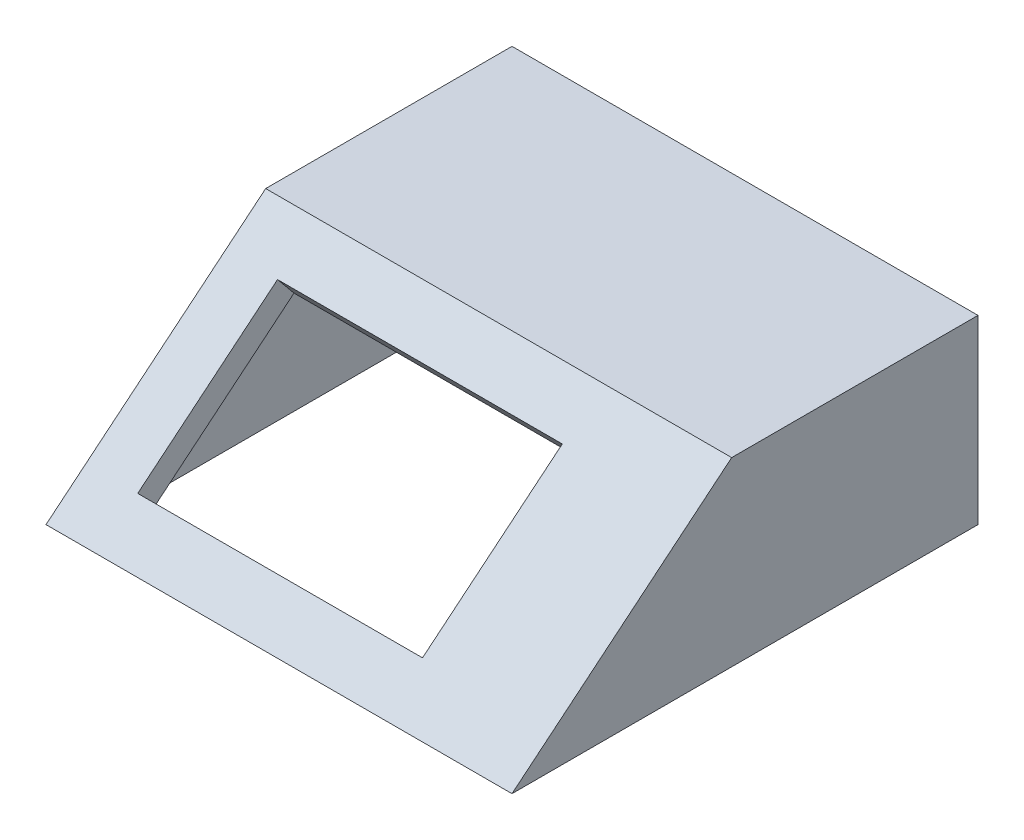
ISO-10303-21;
HEADER;
FILE_DESCRIPTION(('STEP AP214'),'2;1');
FILE_NAME('part.step','',(''),(''),'','','');
FILE_SCHEMA(('AUTOMOTIVE_DESIGN { 1 0 10303 214 1 1 1 1 }'));
ENDSEC;
DATA;
#1=APPLICATION_CONTEXT('core data for automotive mechanical design processes');
#2=APPLICATION_PROTOCOL_DEFINITION('international standard','automotive_design',2000,#1);
#3=PRODUCT_CONTEXT('',#1,'mechanical');
#4=PRODUCT('Part','Part','',(#3));
#5=PRODUCT_RELATED_PRODUCT_CATEGORY('part','',(#4));
#6=PRODUCT_DEFINITION_FORMATION('','',#4);
#7=PRODUCT_DEFINITION_CONTEXT('part definition',#1,'design');
#8=PRODUCT_DEFINITION('design','',#6,#7);
#9=PRODUCT_DEFINITION_SHAPE('','',#8);
#10=(LENGTH_UNIT() NAMED_UNIT(*) SI_UNIT(.MILLI.,.METRE.));
#11=(NAMED_UNIT(*) PLANE_ANGLE_UNIT() SI_UNIT($,.RADIAN.));
#12=(NAMED_UNIT(*) SI_UNIT($,.STERADIAN.) SOLID_ANGLE_UNIT());
#13=UNCERTAINTY_MEASURE_WITH_UNIT(LENGTH_MEASURE(1.E-05),#10,'distance_accuracy_value','');
#14=(GEOMETRIC_REPRESENTATION_CONTEXT(3) GLOBAL_UNCERTAINTY_ASSIGNED_CONTEXT((#13)) GLOBAL_UNIT_ASSIGNED_CONTEXT((#10,
#11,#12)) REPRESENTATION_CONTEXT('',''));
#15=CARTESIAN_POINT('',(0.,0.,0.));
#16=DIRECTION('',(0.,0.,1.));
#17=DIRECTION('',(1.,0.,0.));
#18=AXIS2_PLACEMENT_3D('',#15,#16,#17);
#19=CARTESIAN_POINT('',(-90.,-17.5,0.));
#20=DIRECTION('',(0.,-1.,0.));
#21=DIRECTION('',(0.,0.,-1.));
#22=AXIS2_PLACEMENT_3D('',#19,#20,#21);
#23=PLANE('',#22);
#24=DIRECTION('',(0.,0.,1.));
#25=VECTOR('',#24,1.);
#26=CARTESIAN_POINT('',(-5.,-17.5,58.3560605784536));
#27=LINE('',#26,#25);
#28=CARTESIAN_POINT('',(-5.,-17.5,-18.7867965644036));
#29=VERTEX_POINT('',#28);
#30=CARTESIAN_POINT('',(-5.,-17.5,58.3560605784536));
#31=VERTEX_POINT('',#30);
#32=EDGE_CURVE('E196',#29,#31,#27,.T.);
#33=ORIENTED_EDGE('',*,*,#32,.F.);
#34=DIRECTION('',(-1.,0.,0.));
#35=VECTOR('',#34,1.);
#36=CARTESIAN_POINT('',(82.7708910678342,-17.5,-18.7867965644036));
#37=LINE('',#36,#35);
#38=CARTESIAN_POINT('',(-85.,-17.5,-18.7867965644036));
#39=VERTEX_POINT('',#38);
#40=EDGE_CURVE('E201',#29,#39,#37,.T.);
#41=ORIENTED_EDGE('',*,*,#40,.T.);
#42=DIRECTION('',(0.,0.,-1.));
#43=VECTOR('',#42,1.);
#44=CARTESIAN_POINT('',(-85.,-17.5,58.3560605784536));
#45=LINE('',#44,#43);
#46=CARTESIAN_POINT('',(-85.,-17.5,58.3560605784536));
#47=VERTEX_POINT('',#46);
#48=EDGE_CURVE('E184',#47,#39,#45,.T.);
#49=ORIENTED_EDGE('',*,*,#48,.F.);
#50=DIRECTION('',(-1.,0.,0.));
#51=VECTOR('',#50,1.);
#52=CARTESIAN_POINT('',(82.7708910678342,-17.5,58.3560605784536));
#53=LINE('',#52,#51);
#54=EDGE_CURVE('E200',#31,#47,#53,.T.);
#55=ORIENTED_EDGE('',*,*,#54,.F.);
#56=EDGE_LOOP('',(#33,#41,#49,#55));
#57=FACE_BOUND('',#56,.T.);
#58=DIRECTION('',(0.,0.,-1.));
#59=VECTOR('',#58,1.);
#60=CARTESIAN_POINT('',(0.,-17.5,0.));
#61=LINE('',#60,#59);
#62=CARTESIAN_POINT('',(0.,-17.5,66.2132034355964));
#63=VERTEX_POINT('',#62);
#64=CARTESIAN_POINT('',(0.,-17.5,-23.7867965644036));
#65=VERTEX_POINT('',#64);
#66=EDGE_CURVE('E221',#63,#65,#61,.T.);
#67=ORIENTED_EDGE('',*,*,#66,.F.);
#68=DIRECTION('',(1.,0.,0.));
#69=VECTOR('',#68,1.);
#70=CARTESIAN_POINT('',(-90.,-17.5,66.2132034355964));
#71=LINE('',#70,#69);
#72=CARTESIAN_POINT('',(-90.,-17.5,66.2132034355964));
#73=VERTEX_POINT('',#72);
#74=EDGE_CURVE('E12',#73,#63,#71,.T.);
#75=ORIENTED_EDGE('',*,*,#74,.F.);
#76=DIRECTION('',(0.,0.,-1.));
#77=VECTOR('',#76,1.);
#78=CARTESIAN_POINT('',(-90.,-17.5,0.));
#79=LINE('',#78,#77);
#80=CARTESIAN_POINT('',(-90.,-17.5,-23.7867965644036));
#81=VERTEX_POINT('',#80);
#82=EDGE_CURVE('E222',#73,#81,#79,.T.);
#83=ORIENTED_EDGE('',*,*,#82,.T.);
#84=DIRECTION('',(1.,0.,0.));
#85=VECTOR('',#84,1.);
#86=CARTESIAN_POINT('',(-90.,-17.5,-23.7867965644036));
#87=LINE('',#86,#85);
#88=EDGE_CURVE('E50',#81,#65,#87,.T.);
#89=ORIENTED_EDGE('',*,*,#88,.T.);
#90=EDGE_LOOP('',(#67,#75,#83,#89));
#91=FACE_BOUND('',#90,.T.);
#92=ADVANCED_FACE('F47',(#57,#91),#23,.T.);
#93=CARTESIAN_POINT('',(-90.,22.0897820899599,18.2231404958678));
#94=DIRECTION('',(0.,0.77138921583987,0.636363636363636));
#95=DIRECTION('',(0.,-0.636363636363636,0.77138921583987));
#96=AXIS2_PLACEMENT_3D('',#93,#94,#95);
#97=PLANE('',#96);
#98=DIRECTION('',(0.,0.636363636363636,-0.77138921583987));
#99=VECTOR('',#98,1.);
#100=CARTESIAN_POINT('',(-25.,-11.1363636363636,58.4993112771977));
#101=LINE('',#100,#99);
#102=CARTESIAN_POINT('',(-25.,-11.1363636363636,58.4993112771977));
#103=VERTEX_POINT('',#102);
#104=CARTESIAN_POINT('',(-25.,11.1363636363636,31.5006887228023));
#105=VERTEX_POINT('',#104);
#106=EDGE_CURVE('E64',#103,#105,#101,.T.);
#107=ORIENTED_EDGE('',*,*,#106,.F.);
#108=DIRECTION('',(1.,0.,0.));
#109=VECTOR('',#108,1.);
#110=CARTESIAN_POINT('',(-80.,-11.1363636363636,58.4993112771977));
#111=LINE('',#110,#109);
#112=CARTESIAN_POINT('',(-80.,-11.1363636363636,58.4993112771977));
#113=VERTEX_POINT('',#112);
#114=EDGE_CURVE('E158',#113,#103,#111,.T.);
#115=ORIENTED_EDGE('',*,*,#114,.F.);
#116=DIRECTION('',(0.,-0.636363636363636,0.77138921583987));
#117=VECTOR('',#116,1.);
#118=CARTESIAN_POINT('',(-80.,-11.1363636363636,58.4993112771977));
#119=LINE('',#118,#117);
#120=CARTESIAN_POINT('',(-80.,11.1363636363636,31.5006887228023));
#121=VERTEX_POINT('',#120);
#122=EDGE_CURVE('E140',#121,#113,#119,.T.);
#123=ORIENTED_EDGE('',*,*,#122,.F.);
#124=DIRECTION('',(-1.,0.,0.));
#125=VECTOR('',#124,1.);
#126=CARTESIAN_POINT('',(-80.,11.1363636363636,31.5006887228023));
#127=LINE('',#126,#125);
#128=EDGE_CURVE('E150',#105,#121,#127,.T.);
#129=ORIENTED_EDGE('',*,*,#128,.F.);
#130=EDGE_LOOP('',(#107,#115,#123,#129));
#131=FACE_BOUND('',#130,.T.);
#132=DIRECTION('',(0.,-0.636363636363636,0.77138921583987));
#133=VECTOR('',#132,1.);
#134=CARTESIAN_POINT('',(0.,22.0897820899599,18.2231404958678));
#135=LINE('',#134,#133);
#136=CARTESIAN_POINT('',(0.,17.5,23.7867965644036));
#137=VERTEX_POINT('',#136);
#138=EDGE_CURVE('E227',#137,#63,#135,.T.);
#139=ORIENTED_EDGE('',*,*,#138,.F.);
#140=DIRECTION('',(1.,0.,0.));
#141=VECTOR('',#140,1.);
#142=CARTESIAN_POINT('',(-90.,17.5,23.7867965644036));
#143=LINE('',#142,#141);
#144=CARTESIAN_POINT('',(-90.,17.5,23.7867965644036));
#145=VERTEX_POINT('',#144);
#146=EDGE_CURVE('E56',#145,#137,#143,.T.);
#147=ORIENTED_EDGE('',*,*,#146,.F.);
#148=DIRECTION('',(0.,-0.636363636363636,0.77138921583987));
#149=VECTOR('',#148,1.);
#150=CARTESIAN_POINT('',(-90.,22.0897820899599,18.2231404958678));
#151=LINE('',#150,#149);
#152=EDGE_CURVE('E234',#145,#73,#151,.T.);
#153=ORIENTED_EDGE('',*,*,#152,.T.);
#154=ORIENTED_EDGE('',*,*,#74,.T.);
#155=EDGE_LOOP('',(#139,#147,#153,#154));
#156=FACE_BOUND('',#155,.T.);
#157=ADVANCED_FACE('F155',(#131,#156),#97,.T.);
#158=CARTESIAN_POINT('',(-90.,17.5,0.));
#159=DIRECTION('',(0.,-1.,0.));
#160=DIRECTION('',(0.,0.,-1.));
#161=AXIS2_PLACEMENT_3D('',#158,#159,#160);
#162=PLANE('',#161);
#163=DIRECTION('',(0.,0.,-1.));
#164=VECTOR('',#163,1.);
#165=CARTESIAN_POINT('',(0.,17.5,0.));
#166=LINE('',#165,#164);
#167=CARTESIAN_POINT('',(0.,17.5,-23.7867965644036));
#168=VERTEX_POINT('',#167);
#169=EDGE_CURVE('E245',#137,#168,#166,.T.);
#170=ORIENTED_EDGE('',*,*,#169,.T.);
#171=DIRECTION('',(1.,0.,0.));
#172=VECTOR('',#171,1.);
#173=CARTESIAN_POINT('',(-90.,17.5,-23.7867965644036));
#174=LINE('',#173,#172);
#175=CARTESIAN_POINT('',(-90.,17.5,-23.7867965644036));
#176=VERTEX_POINT('',#175);
#177=EDGE_CURVE('E253',#176,#168,#174,.T.);
#178=ORIENTED_EDGE('',*,*,#177,.F.);
#179=DIRECTION('',(0.,0.,-1.));
#180=VECTOR('',#179,1.);
#181=CARTESIAN_POINT('',(-90.,17.5,0.));
#182=LINE('',#181,#180);
#183=EDGE_CURVE('E231',#145,#176,#182,.T.);
#184=ORIENTED_EDGE('',*,*,#183,.F.);
#185=ORIENTED_EDGE('',*,*,#146,.T.);
#186=EDGE_LOOP('',(#170,#178,#184,#185));
#187=FACE_BOUND('',#186,.T.);
#188=ADVANCED_FACE('F273',(#187),#162,.F.);
#189=CARTESIAN_POINT('',(-90.,0.,-23.7867965644036));
#190=DIRECTION('',(0.,0.,-1.));
#191=DIRECTION('',(0.,1.,0.));
#192=AXIS2_PLACEMENT_3D('',#189,#190,#191);
#193=PLANE('',#192);
#194=DIRECTION('',(0.,1.,0.));
#195=VECTOR('',#194,1.);
#196=CARTESIAN_POINT('',(0.,0.,-23.7867965644036));
#197=LINE('',#196,#195);
#198=EDGE_CURVE('E241',#65,#168,#197,.T.);
#199=ORIENTED_EDGE('',*,*,#198,.F.);
#200=ORIENTED_EDGE('',*,*,#88,.F.);
#201=DIRECTION('',(0.,1.,0.));
#202=VECTOR('',#201,1.);
#203=CARTESIAN_POINT('',(-90.,0.,-23.7867965644036));
#204=LINE('',#203,#202);
#205=EDGE_CURVE('E226',#81,#176,#204,.T.);
#206=ORIENTED_EDGE('',*,*,#205,.T.);
#207=ORIENTED_EDGE('',*,*,#177,.T.);
#208=EDGE_LOOP('',(#199,#200,#206,#207));
#209=FACE_BOUND('',#208,.T.);
#210=ADVANCED_FACE('F263',(#209),#193,.T.);
#211=CARTESIAN_POINT('',(-90.,0.,0.));
#212=DIRECTION('',(1.,0.,0.));
#213=DIRECTION('',(0.,0.,-1.));
#214=AXIS2_PLACEMENT_3D('',#211,#212,#213);
#215=PLANE('',#214);
#216=ORIENTED_EDGE('',*,*,#82,.F.);
#217=ORIENTED_EDGE('',*,*,#152,.F.);
#218=ORIENTED_EDGE('',*,*,#183,.T.);
#219=ORIENTED_EDGE('',*,*,#205,.F.);
#220=EDGE_LOOP('',(#216,#217,#218,#219));
#221=FACE_BOUND('',#220,.T.);
#222=ADVANCED_FACE('F271',(#221),#215,.F.);
#223=CARTESIAN_POINT('',(0.,0.,0.));
#224=DIRECTION('',(1.,0.,0.));
#225=DIRECTION('',(0.,0.,-1.));
#226=AXIS2_PLACEMENT_3D('',#223,#224,#225);
#227=PLANE('',#226);
#228=ORIENTED_EDGE('',*,*,#66,.T.);
#229=ORIENTED_EDGE('',*,*,#198,.T.);
#230=ORIENTED_EDGE('',*,*,#169,.F.);
#231=ORIENTED_EDGE('',*,*,#138,.T.);
#232=EDGE_LOOP('',(#228,#229,#230,#231));
#233=FACE_BOUND('',#232,.T.);
#234=ADVANCED_FACE('F266',(#233),#227,.T.);
#235=CARTESIAN_POINT('',(-5.,0.,0.));
#236=DIRECTION('',(1.,0.,0.));
#237=DIRECTION('',(0.,0.,-1.));
#238=AXIS2_PLACEMENT_3D('',#235,#236,#237);
#239=PLANE('',#238);
#240=ORIENTED_EDGE('',*,*,#32,.T.);
#241=DIRECTION('',(0.,0.636363636363636,-0.77138921583987));
#242=VECTOR('',#241,1.);
#243=CARTESIAN_POINT('',(-5.,12.5,21.990568974574));
#244=LINE('',#243,#242);
#245=CARTESIAN_POINT('',(-5.,12.5,21.990568974574));
#246=VERTEX_POINT('',#245);
#247=EDGE_CURVE('E188',#31,#246,#244,.T.);
#248=ORIENTED_EDGE('',*,*,#247,.T.);
#249=DIRECTION('',(0.,0.,-1.));
#250=VECTOR('',#249,1.);
#251=CARTESIAN_POINT('',(-5.,12.5,-18.7867965644036));
#252=LINE('',#251,#250);
#253=CARTESIAN_POINT('',(-5.,12.5,-18.7867965644036));
#254=VERTEX_POINT('',#253);
#255=EDGE_CURVE('E207',#246,#254,#252,.T.);
#256=ORIENTED_EDGE('',*,*,#255,.T.);
#257=DIRECTION('',(0.,-1.,0.));
#258=VECTOR('',#257,1.);
#259=CARTESIAN_POINT('',(-5.,-17.5,-18.7867965644036));
#260=LINE('',#259,#258);
#261=EDGE_CURVE('E202',#254,#29,#260,.T.);
#262=ORIENTED_EDGE('',*,*,#261,.T.);
#263=EDGE_LOOP('',(#240,#248,#256,#262));
#264=FACE_BOUND('',#263,.T.);
#265=ADVANCED_FACE('F289',(#264),#239,.F.);
#266=CARTESIAN_POINT('',(82.7708910678342,12.5,21.990568974574));
#267=DIRECTION('',(0.,0.77138921583987,0.636363636363636));
#268=DIRECTION('',(0.,-0.636363636363636,0.77138921583987));
#269=AXIS2_PLACEMENT_3D('',#266,#267,#268);
#270=PLANE('',#269);
#271=DIRECTION('',(-1.,0.,0.));
#272=VECTOR('',#271,1.);
#273=CARTESIAN_POINT('',(-80.,-14.993309715563,55.3174930953795));
#274=LINE('',#273,#272);
#275=CARTESIAN_POINT('',(-25.,-14.993309715563,55.3174930953795));
#276=VERTEX_POINT('',#275);
#277=CARTESIAN_POINT('',(-80.,-14.993309715563,55.3174930953795));
#278=VERTEX_POINT('',#277);
#279=EDGE_CURVE('E467',#276,#278,#274,.T.);
#280=ORIENTED_EDGE('',*,*,#279,.F.);
#281=DIRECTION('',(0.,-0.636363636363636,0.77138921583987));
#282=VECTOR('',#281,1.);
#283=CARTESIAN_POINT('',(-25.,-14.993309715563,55.3174930953795));
#284=LINE('',#283,#282);
#285=CARTESIAN_POINT('',(-25.,7.2794175571643,28.3188705409841));
#286=VERTEX_POINT('',#285);
#287=EDGE_CURVE('E176',#286,#276,#284,.T.);
#288=ORIENTED_EDGE('',*,*,#287,.F.);
#289=DIRECTION('',(1.,0.,0.));
#290=VECTOR('',#289,1.);
#291=CARTESIAN_POINT('',(-80.,7.2794175571643,28.3188705409841));
#292=LINE('',#291,#290);
#293=CARTESIAN_POINT('',(-80.,7.27941755716429,28.3188705409841));
#294=VERTEX_POINT('',#293);
#295=EDGE_CURVE('E172',#294,#286,#292,.T.);
#296=ORIENTED_EDGE('',*,*,#295,.F.);
#297=DIRECTION('',(0.,0.636363636363636,-0.77138921583987));
#298=VECTOR('',#297,1.);
#299=CARTESIAN_POINT('',(-80.,-14.993309715563,55.3174930953795));
#300=LINE('',#299,#298);
#301=EDGE_CURVE('E143',#278,#294,#300,.T.);
#302=ORIENTED_EDGE('',*,*,#301,.F.);
#303=EDGE_LOOP('',(#280,#288,#296,#302));
#304=FACE_BOUND('',#303,.T.);
#305=ORIENTED_EDGE('',*,*,#54,.T.);
#306=DIRECTION('',(0.,-0.636363636363636,0.77138921583987));
#307=VECTOR('',#306,1.);
#308=CARTESIAN_POINT('',(-85.,12.5,21.990568974574));
#309=LINE('',#308,#307);
#310=CARTESIAN_POINT('',(-85.,12.5,21.990568974574));
#311=VERTEX_POINT('',#310);
#312=EDGE_CURVE('E181',#311,#47,#309,.T.);
#313=ORIENTED_EDGE('',*,*,#312,.F.);
#314=DIRECTION('',(-1.,0.,0.));
#315=VECTOR('',#314,1.);
#316=CARTESIAN_POINT('',(82.7708910678342,12.5,21.990568974574));
#317=LINE('',#316,#315);
#318=EDGE_CURVE('E195',#246,#311,#317,.T.);
#319=ORIENTED_EDGE('',*,*,#318,.F.);
#320=ORIENTED_EDGE('',*,*,#247,.F.);
#321=EDGE_LOOP('',(#305,#313,#319,#320));
#322=FACE_BOUND('',#321,.T.);
#323=ADVANCED_FACE('F301',(#304,#322),#270,.F.);
#324=CARTESIAN_POINT('',(82.7708910678342,12.5,-18.7867965644036));
#325=DIRECTION('',(0.,1.,0.));
#326=DIRECTION('',(0.,0.,1.));
#327=AXIS2_PLACEMENT_3D('',#324,#325,#326);
#328=PLANE('',#327);
#329=ORIENTED_EDGE('',*,*,#318,.T.);
#330=DIRECTION('',(0.,0.,1.));
#331=VECTOR('',#330,1.);
#332=CARTESIAN_POINT('',(-85.,12.5,-18.7867965644036));
#333=LINE('',#332,#331);
#334=CARTESIAN_POINT('',(-85.,12.5,-18.7867965644036));
#335=VERTEX_POINT('',#334);
#336=EDGE_CURVE('E177',#335,#311,#333,.T.);
#337=ORIENTED_EDGE('',*,*,#336,.F.);
#338=DIRECTION('',(-1.,0.,0.));
#339=VECTOR('',#338,1.);
#340=CARTESIAN_POINT('',(82.7708910678342,12.5,-18.7867965644036));
#341=LINE('',#340,#339);
#342=EDGE_CURVE('E206',#254,#335,#341,.T.);
#343=ORIENTED_EDGE('',*,*,#342,.F.);
#344=ORIENTED_EDGE('',*,*,#255,.F.);
#345=EDGE_LOOP('',(#329,#337,#343,#344));
#346=FACE_BOUND('',#345,.T.);
#347=ADVANCED_FACE('F295',(#346),#328,.F.);
#348=CARTESIAN_POINT('',(82.7708910678342,-17.5,-18.7867965644036));
#349=DIRECTION('',(0.,0.,-1.));
#350=DIRECTION('',(0.,1.,0.));
#351=AXIS2_PLACEMENT_3D('',#348,#349,#350);
#352=PLANE('',#351);
#353=ORIENTED_EDGE('',*,*,#342,.T.);
#354=DIRECTION('',(0.,1.,0.));
#355=VECTOR('',#354,1.);
#356=CARTESIAN_POINT('',(-85.,-17.5,-18.7867965644036));
#357=LINE('',#356,#355);
#358=EDGE_CURVE('E175',#39,#335,#357,.T.);
#359=ORIENTED_EDGE('',*,*,#358,.F.);
#360=ORIENTED_EDGE('',*,*,#40,.F.);
#361=ORIENTED_EDGE('',*,*,#261,.F.);
#362=EDGE_LOOP('',(#353,#359,#360,#361));
#363=FACE_BOUND('',#362,.T.);
#364=ADVANCED_FACE('F292',(#363),#352,.F.);
#365=CARTESIAN_POINT('',(-85.,0.,0.));
#366=DIRECTION('',(1.,0.,0.));
#367=DIRECTION('',(0.,0.,-1.));
#368=AXIS2_PLACEMENT_3D('',#365,#366,#367);
#369=PLANE('',#368);
#370=ORIENTED_EDGE('',*,*,#312,.T.);
#371=ORIENTED_EDGE('',*,*,#48,.T.);
#372=ORIENTED_EDGE('',*,*,#358,.T.);
#373=ORIENTED_EDGE('',*,*,#336,.T.);
#374=EDGE_LOOP('',(#370,#371,#372,#373));
#375=FACE_BOUND('',#374,.T.);
#376=ADVANCED_FACE('F299',(#375),#369,.T.);
#377=CARTESIAN_POINT('',(-25.,-65.2817340280696,13.8316596077263));
#378=DIRECTION('',(1.,0.,0.));
#379=DIRECTION('',(0.,0.,-1.));
#380=AXIS2_PLACEMENT_3D('',#377,#378,#379);
#381=PLANE('',#380);
#382=ORIENTED_EDGE('',*,*,#287,.T.);
#383=DIRECTION('',(0.,0.77138921583987,0.636363636363636));
#384=VECTOR('',#383,1.);
#385=CARTESIAN_POINT('',(-25.,-65.2817340280696,13.8316596077263));
#386=LINE('',#385,#384);
#387=EDGE_CURVE('E165',#276,#103,#386,.T.);
#388=ORIENTED_EDGE('',*,*,#387,.T.);
#389=ORIENTED_EDGE('',*,*,#106,.T.);
#390=DIRECTION('',(0.,0.77138921583987,0.636363636363636));
#391=VECTOR('',#390,1.);
#392=CARTESIAN_POINT('',(-25.,-43.0090067553424,-13.1669629466691));
#393=LINE('',#392,#391);
#394=EDGE_CURVE('E147',#286,#105,#393,.T.);
#395=ORIENTED_EDGE('',*,*,#394,.F.);
#396=EDGE_LOOP('',(#382,#388,#389,#395));
#397=FACE_BOUND('',#396,.T.);
#398=ADVANCED_FACE('F353',(#397),#381,.F.);
#399=CARTESIAN_POINT('',(-80.,-65.2817340280696,13.8316596077263));
#400=DIRECTION('',(0.,-0.636363636363636,0.77138921583987));
#401=DIRECTION('',(0.,-0.77138921583987,-0.636363636363636));
#402=AXIS2_PLACEMENT_3D('',#399,#400,#401);
#403=PLANE('',#402);
#404=ORIENTED_EDGE('',*,*,#279,.T.);
#405=DIRECTION('',(0.,0.77138921583987,0.636363636363636));
#406=VECTOR('',#405,1.);
#407=CARTESIAN_POINT('',(-80.,-65.2817340280696,13.8316596077263));
#408=LINE('',#407,#406);
#409=EDGE_CURVE('E146',#278,#113,#408,.T.);
#410=ORIENTED_EDGE('',*,*,#409,.T.);
#411=ORIENTED_EDGE('',*,*,#114,.T.);
#412=ORIENTED_EDGE('',*,*,#387,.F.);
#413=EDGE_LOOP('',(#404,#410,#411,#412));
#414=FACE_BOUND('',#413,.T.);
#415=ADVANCED_FACE('F375',(#414),#403,.F.);
#416=CARTESIAN_POINT('',(-80.,-65.2817340280696,13.8316596077263));
#417=DIRECTION('',(-1.,0.,0.));
#418=DIRECTION('',(0.,0.,1.));
#419=AXIS2_PLACEMENT_3D('',#416,#417,#418);
#420=PLANE('',#419);
#421=ORIENTED_EDGE('',*,*,#301,.T.);
#422=DIRECTION('',(0.,0.77138921583987,0.636363636363636));
#423=VECTOR('',#422,1.);
#424=CARTESIAN_POINT('',(-80.,-43.0090067553424,-13.1669629466691));
#425=LINE('',#424,#423);
#426=EDGE_CURVE('E72',#294,#121,#425,.T.);
#427=ORIENTED_EDGE('',*,*,#426,.T.);
#428=ORIENTED_EDGE('',*,*,#122,.T.);
#429=ORIENTED_EDGE('',*,*,#409,.F.);
#430=EDGE_LOOP('',(#421,#427,#428,#429));
#431=FACE_BOUND('',#430,.T.);
#432=ADVANCED_FACE('F137',(#431),#420,.F.);
#433=CARTESIAN_POINT('',(-80.,-43.0090067553424,-13.1669629466691));
#434=DIRECTION('',(0.,0.636363636363636,-0.77138921583987));
#435=DIRECTION('',(0.,0.77138921583987,0.636363636363636));
#436=AXIS2_PLACEMENT_3D('',#433,#434,#435);
#437=PLANE('',#436);
#438=ORIENTED_EDGE('',*,*,#295,.T.);
#439=ORIENTED_EDGE('',*,*,#394,.T.);
#440=ORIENTED_EDGE('',*,*,#128,.T.);
#441=ORIENTED_EDGE('',*,*,#426,.F.);
#442=EDGE_LOOP('',(#438,#439,#440,#441));
#443=FACE_BOUND('',#442,.T.);
#444=ADVANCED_FACE('F151',(#443),#437,.F.);
#445=CLOSED_SHELL('',(#92,#157,#188,#210,#222,#234,#265,#323,#347,#364,#376,#398,#415,#432,#444));
#446=MANIFOLD_SOLID_BREP('B2',#445);
#447=ADVANCED_BREP_SHAPE_REPRESENTATION('',(#18,#446),#14);
#448=SHAPE_DEFINITION_REPRESENTATION(#9,#447);
ENDSEC;
END-ISO-10303-21;
